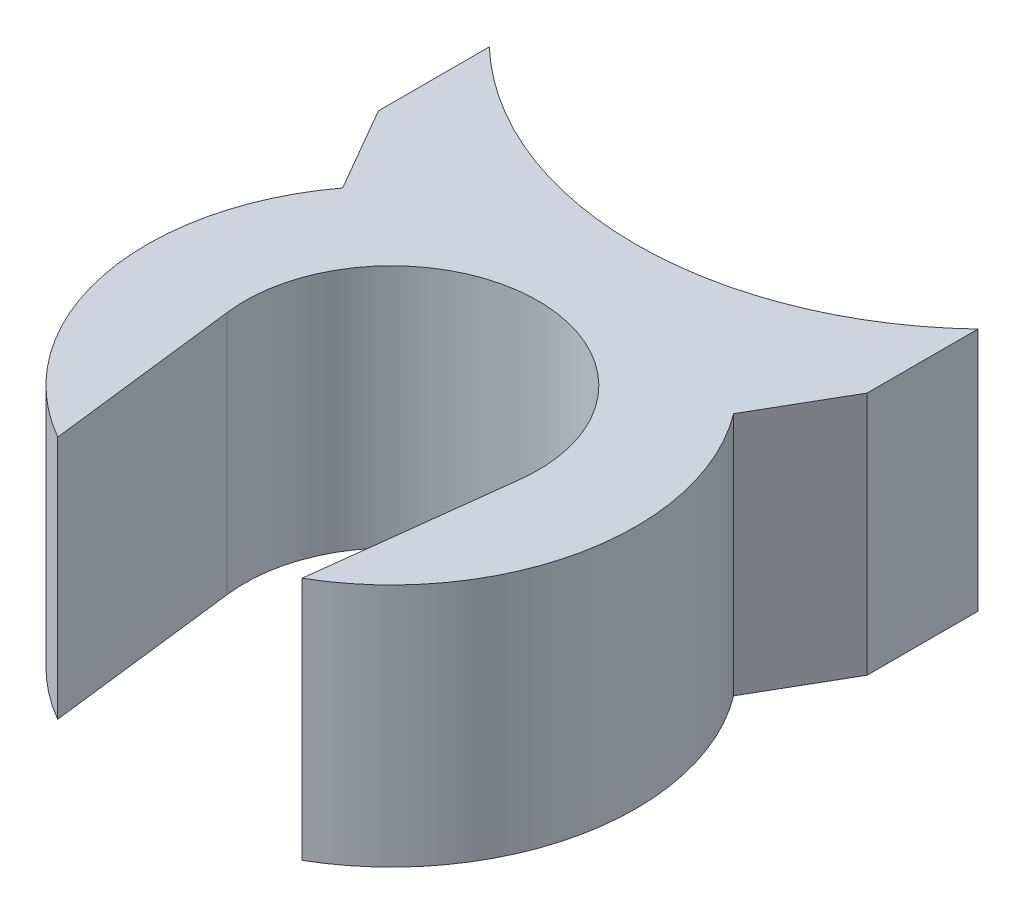
ISO-10303-21;
HEADER;
FILE_DESCRIPTION(('STEP AP214'),'2;1');
FILE_NAME('part.step','',(''),(''),'','','');
FILE_SCHEMA(('AUTOMOTIVE_DESIGN { 1 0 10303 214 1 1 1 1 }'));
ENDSEC;
DATA;
#1=APPLICATION_CONTEXT('core data for automotive mechanical design processes');
#2=APPLICATION_PROTOCOL_DEFINITION('international standard','automotive_design',2000,#1);
#3=PRODUCT_CONTEXT('',#1,'mechanical');
#4=PRODUCT('Part','Part','',(#3));
#5=PRODUCT_RELATED_PRODUCT_CATEGORY('part','',(#4));
#6=PRODUCT_DEFINITION_FORMATION('','',#4);
#7=PRODUCT_DEFINITION_CONTEXT('part definition',#1,'design');
#8=PRODUCT_DEFINITION('design','',#6,#7);
#9=PRODUCT_DEFINITION_SHAPE('','',#8);
#10=(LENGTH_UNIT() NAMED_UNIT(*) SI_UNIT(.MILLI.,.METRE.));
#11=(NAMED_UNIT(*) PLANE_ANGLE_UNIT() SI_UNIT($,.RADIAN.));
#12=(NAMED_UNIT(*) SI_UNIT($,.STERADIAN.) SOLID_ANGLE_UNIT());
#13=UNCERTAINTY_MEASURE_WITH_UNIT(LENGTH_MEASURE(1.E-05),#10,'distance_accuracy_value','');
#14=(GEOMETRIC_REPRESENTATION_CONTEXT(3) GLOBAL_UNCERTAINTY_ASSIGNED_CONTEXT((#13)) GLOBAL_UNIT_ASSIGNED_CONTEXT((#10,
#11,#12)) REPRESENTATION_CONTEXT('',''));
#15=CARTESIAN_POINT('',(0.,0.,0.));
#16=DIRECTION('',(0.,0.,1.));
#17=DIRECTION('',(1.,0.,0.));
#18=AXIS2_PLACEMENT_3D('',#15,#16,#17);
#19=CARTESIAN_POINT('',(0.,5.,0.));
#20=DIRECTION('',(0.,-1.,0.));
#21=DIRECTION('',(0.,0.,-1.));
#22=AXIS2_PLACEMENT_3D('',#19,#20,#21);
#23=CYLINDRICAL_SURFACE('',#22,5.);
#24=DIRECTION('',(0.,1.,0.));
#25=VECTOR('',#24,1.);
#26=CARTESIAN_POINT('',(-2.5,-5.,4.33012701892219));
#27=LINE('',#26,#25);
#28=CARTESIAN_POINT('',(-2.5,0.,4.33012701892219));
#29=VERTEX_POINT('',#28);
#30=CARTESIAN_POINT('',(-2.5,5.,4.33012701892219));
#31=VERTEX_POINT('',#30);
#32=EDGE_CURVE('E233',#29,#31,#27,.T.);
#33=ORIENTED_EDGE('',*,*,#32,.T.);
#34=CARTESIAN_POINT('',(0.,5.,0.));
#35=DIRECTION('',(0.,1.,0.));
#36=DIRECTION('',(0.,0.,1.));
#37=AXIS2_PLACEMENT_3D('',#34,#35,#36);
#38=CIRCLE('',#37,5.);
#39=CARTESIAN_POINT('',(-4.,5.,-3.));
#40=VERTEX_POINT('',#39);
#41=EDGE_CURVE('E137',#40,#31,#38,.T.);
#42=ORIENTED_EDGE('',*,*,#41,.F.);
#43=DIRECTION('',(0.,-1.,0.));
#44=VECTOR('',#43,1.);
#45=CARTESIAN_POINT('',(-4.,5.,-3.));
#46=LINE('',#45,#44);
#47=CARTESIAN_POINT('',(-4.,0.,-3.));
#48=VERTEX_POINT('',#47);
#49=EDGE_CURVE('E167',#40,#48,#46,.T.);
#50=ORIENTED_EDGE('',*,*,#49,.T.);
#51=CARTESIAN_POINT('',(0.,0.,0.));
#52=DIRECTION('',(0.,1.,0.));
#53=DIRECTION('',(0.,0.,1.));
#54=AXIS2_PLACEMENT_3D('',#51,#52,#53);
#55=CIRCLE('',#54,5.);
#56=EDGE_CURVE('E157',#48,#29,#55,.T.);
#57=ORIENTED_EDGE('',*,*,#56,.T.);
#58=EDGE_LOOP('',(#33,#42,#50,#57));
#59=FACE_BOUND('',#58,.T.);
#60=ADVANCED_FACE('F39',(#59),#23,.T.);
#61=CARTESIAN_POINT('',(0.,5.,-12.25));
#62=DIRECTION('',(0.,1.,0.));
#63=DIRECTION('',(0.,0.,1.));
#64=AXIS2_PLACEMENT_3D('',#61,#62,#63);
#65=PLANE('',#64);
#66=DIRECTION('',(-0.500000000000003,0.,0.866025403784437));
#67=VECTOR('',#66,1.);
#68=CARTESIAN_POINT('',(3.99999999999999,5.,-3.00000000000001));
#69=LINE('',#68,#67);
#70=CARTESIAN_POINT('',(5.,5.,-4.73205080756888));
#71=VERTEX_POINT('',#70);
#72=CARTESIAN_POINT('',(3.99999999999999,5.,-3.00000000000001));
#73=VERTEX_POINT('',#72);
#74=EDGE_CURVE('E115',#71,#73,#69,.T.);
#75=ORIENTED_EDGE('',*,*,#74,.F.);
#76=DIRECTION('',(0.,0.,-1.));
#77=VECTOR('',#76,1.);
#78=CARTESIAN_POINT('',(5.,5.,-7.));
#79=LINE('',#78,#77);
#80=CARTESIAN_POINT('',(5.,5.,-7.));
#81=VERTEX_POINT('',#80);
#82=EDGE_CURVE('E123',#71,#81,#79,.T.);
#83=ORIENTED_EDGE('',*,*,#82,.T.);
#84=CARTESIAN_POINT('',(0.,5.,-12.25));
#85=DIRECTION('',(0.,-1.,0.));
#86=DIRECTION('',(0.,0.,1.));
#87=AXIS2_PLACEMENT_3D('',#84,#85,#86);
#88=CIRCLE('',#87,7.25);
#89=CARTESIAN_POINT('',(-5.,5.,-7.));
#90=VERTEX_POINT('',#89);
#91=EDGE_CURVE('E163',#81,#90,#88,.T.);
#92=ORIENTED_EDGE('',*,*,#91,.T.);
#93=DIRECTION('',(0.,0.,1.));
#94=VECTOR('',#93,1.);
#95=CARTESIAN_POINT('',(-5.,5.,-7.));
#96=LINE('',#95,#94);
#97=CARTESIAN_POINT('',(-5.00000000000001,5.,-4.73205080756886));
#98=VERTEX_POINT('',#97);
#99=EDGE_CURVE('E204',#90,#98,#96,.T.);
#100=ORIENTED_EDGE('',*,*,#99,.T.);
#101=DIRECTION('',(-0.500000000000005,0.,-0.866025403784436));
#102=VECTOR('',#101,1.);
#103=CARTESIAN_POINT('',(-4.,5.,-3.));
#104=LINE('',#103,#102);
#105=EDGE_CURVE('E209',#40,#98,#104,.T.);
#106=ORIENTED_EDGE('',*,*,#105,.F.);
#107=ORIENTED_EDGE('',*,*,#41,.T.);
#108=DIRECTION('',(-0.119580915949593,0.,-0.992824458069329));
#109=VECTOR('',#108,1.);
#110=CARTESIAN_POINT('',(-2.97833606685758,5.,0.358726209840881));
#111=LINE('',#110,#109);
#112=CARTESIAN_POINT('',(-2.97489143229235,5.,0.387325400759562));
#113=VERTEX_POINT('',#112);
#114=EDGE_CURVE('E227',#31,#113,#111,.T.);
#115=ORIENTED_EDGE('',*,*,#114,.T.);
#116=CARTESIAN_POINT('',(0.,5.,0.));
#117=DIRECTION('',(0.,1.,0.));
#118=DIRECTION('',(0.,0.,1.));
#119=AXIS2_PLACEMENT_3D('',#116,#117,#118);
#120=CIRCLE('',#119,3.);
#121=CARTESIAN_POINT('',(2.97489143229235,5.,0.387325400759561));
#122=VERTEX_POINT('',#121);
#123=EDGE_CURVE('E152',#122,#113,#120,.T.);
#124=ORIENTED_EDGE('',*,*,#123,.F.);
#125=DIRECTION('',(0.119580915949592,0.,-0.992824458069329));
#126=VECTOR('',#125,1.);
#127=CARTESIAN_POINT('',(2.97833606685758,5.,0.35872620984088));
#128=LINE('',#127,#126);
#129=CARTESIAN_POINT('',(2.5,5.,4.33012701892219));
#130=VERTEX_POINT('',#129);
#131=EDGE_CURVE('E184',#130,#122,#128,.T.);
#132=ORIENTED_EDGE('',*,*,#131,.F.);
#133=EDGE_CURVE('E127',#130,#73,#38,.T.);
#134=ORIENTED_EDGE('',*,*,#133,.T.);
#135=EDGE_LOOP('',(#75,#83,#92,#100,#106,#107,#115,#124,#132,#134));
#136=FACE_BOUND('',#135,.T.);
#137=ADVANCED_FACE('F121',(#136),#65,.T.);
#138=CARTESIAN_POINT('',(0.,0.,-12.25));
#139=DIRECTION('',(0.,1.,0.));
#140=DIRECTION('',(0.,0.,1.));
#141=AXIS2_PLACEMENT_3D('',#138,#139,#140);
#142=PLANE('',#141);
#143=DIRECTION('',(0.,0.,-1.));
#144=VECTOR('',#143,1.);
#145=CARTESIAN_POINT('',(5.,0.,-7.));
#146=LINE('',#145,#144);
#147=CARTESIAN_POINT('',(5.,0.,-4.73205080756888));
#148=VERTEX_POINT('',#147);
#149=CARTESIAN_POINT('',(5.,0.,-7.));
#150=VERTEX_POINT('',#149);
#151=EDGE_CURVE('E161',#148,#150,#146,.T.);
#152=ORIENTED_EDGE('',*,*,#151,.F.);
#153=DIRECTION('',(-0.500000000000003,0.,0.866025403784437));
#154=VECTOR('',#153,1.);
#155=CARTESIAN_POINT('',(7.00536749250303,0.,-8.20544919243109));
#156=LINE('',#155,#154);
#157=CARTESIAN_POINT('',(3.99999999999999,0.,-3.00000000000001));
#158=VERTEX_POINT('',#157);
#159=EDGE_CURVE('E55',#148,#158,#156,.T.);
#160=ORIENTED_EDGE('',*,*,#159,.T.);
#161=CARTESIAN_POINT('',(2.5,0.,4.33012701892219));
#162=VERTEX_POINT('',#161);
#163=EDGE_CURVE('E156',#162,#158,#55,.T.);
#164=ORIENTED_EDGE('',*,*,#163,.F.);
#165=DIRECTION('',(0.119580915949592,0.,-0.992824458069329));
#166=VECTOR('',#165,1.);
#167=CARTESIAN_POINT('',(4.43269107825291,0.,-11.7161037457822));
#168=LINE('',#167,#166);
#169=CARTESIAN_POINT('',(2.97489143229235,0.,0.387325400759561));
#170=VERTEX_POINT('',#169);
#171=EDGE_CURVE('E182',#162,#170,#168,.T.);
#172=ORIENTED_EDGE('',*,*,#171,.T.);
#173=CARTESIAN_POINT('',(0.,0.,0.));
#174=DIRECTION('',(0.,1.,0.));
#175=DIRECTION('',(0.,0.,1.));
#176=AXIS2_PLACEMENT_3D('',#173,#174,#175);
#177=CIRCLE('',#176,3.);
#178=CARTESIAN_POINT('',(-2.97489143229235,0.,0.387325400759562));
#179=VERTEX_POINT('',#178);
#180=EDGE_CURVE('E193',#170,#179,#177,.T.);
#181=ORIENTED_EDGE('',*,*,#180,.T.);
#182=DIRECTION('',(-0.119580915949593,0.,-0.992824458069329));
#183=VECTOR('',#182,1.);
#184=CARTESIAN_POINT('',(-4.43269107825292,0.,-11.7161037457822));
#185=LINE('',#184,#183);
#186=EDGE_CURVE('E62',#29,#179,#185,.T.);
#187=ORIENTED_EDGE('',*,*,#186,.F.);
#188=ORIENTED_EDGE('',*,*,#56,.F.);
#189=DIRECTION('',(-0.500000000000005,0.,-0.866025403784436));
#190=VECTOR('',#189,1.);
#191=CARTESIAN_POINT('',(-7.00536749250304,0.,-8.20544919243106));
#192=LINE('',#191,#190);
#193=CARTESIAN_POINT('',(-5.00000000000001,0.,-4.73205080756886));
#194=VERTEX_POINT('',#193);
#195=EDGE_CURVE('E224',#48,#194,#192,.T.);
#196=ORIENTED_EDGE('',*,*,#195,.T.);
#197=DIRECTION('',(0.,0.,1.));
#198=VECTOR('',#197,1.);
#199=CARTESIAN_POINT('',(-5.,0.,-7.));
#200=LINE('',#199,#198);
#201=CARTESIAN_POINT('',(-5.,0.,-7.));
#202=VERTEX_POINT('',#201);
#203=EDGE_CURVE('E151',#202,#194,#200,.T.);
#204=ORIENTED_EDGE('',*,*,#203,.F.);
#205=CARTESIAN_POINT('',(0.,0.,-12.25));
#206=DIRECTION('',(0.,-1.,0.));
#207=DIRECTION('',(0.,0.,1.));
#208=AXIS2_PLACEMENT_3D('',#205,#206,#207);
#209=CIRCLE('',#208,7.25);
#210=EDGE_CURVE('E147',#150,#202,#209,.T.);
#211=ORIENTED_EDGE('',*,*,#210,.F.);
#212=EDGE_LOOP('',(#152,#160,#164,#172,#181,#187,#188,#196,#204,#211));
#213=FACE_BOUND('',#212,.T.);
#214=ADVANCED_FACE('F192',(#213),#142,.F.);
#215=CARTESIAN_POINT('',(0.,5.,-12.25));
#216=DIRECTION('',(0.,-1.,0.));
#217=DIRECTION('',(0.,0.,-1.));
#218=AXIS2_PLACEMENT_3D('',#215,#216,#217);
#219=CYLINDRICAL_SURFACE('',#218,7.25);
#220=ORIENTED_EDGE('',*,*,#210,.T.);
#221=DIRECTION('',(0.,-1.,0.));
#222=VECTOR('',#221,1.);
#223=CARTESIAN_POINT('',(-5.,5.,-7.));
#224=LINE('',#223,#222);
#225=EDGE_CURVE('E171',#90,#202,#224,.T.);
#226=ORIENTED_EDGE('',*,*,#225,.F.);
#227=ORIENTED_EDGE('',*,*,#91,.F.);
#228=DIRECTION('',(0.,-1.,0.));
#229=VECTOR('',#228,1.);
#230=CARTESIAN_POINT('',(5.,5.,-7.));
#231=LINE('',#230,#229);
#232=EDGE_CURVE('E134',#81,#150,#231,.T.);
#233=ORIENTED_EDGE('',*,*,#232,.T.);
#234=EDGE_LOOP('',(#220,#226,#227,#233));
#235=FACE_BOUND('',#234,.T.);
#236=ADVANCED_FACE('F41',(#235),#219,.F.);
#237=CARTESIAN_POINT('',(-5.,5.,-7.));
#238=DIRECTION('',(1.,0.,0.));
#239=DIRECTION('',(0.,0.,-1.));
#240=AXIS2_PLACEMENT_3D('',#237,#238,#239);
#241=PLANE('',#240);
#242=ORIENTED_EDGE('',*,*,#203,.T.);
#243=DIRECTION('',(0.,1.,0.));
#244=VECTOR('',#243,1.);
#245=CARTESIAN_POINT('',(-5.00000000000001,-5.,-4.73205080756886));
#246=LINE('',#245,#244);
#247=EDGE_CURVE('E130',#194,#98,#246,.T.);
#248=ORIENTED_EDGE('',*,*,#247,.T.);
#249=ORIENTED_EDGE('',*,*,#99,.F.);
#250=ORIENTED_EDGE('',*,*,#225,.T.);
#251=EDGE_LOOP('',(#242,#248,#249,#250));
#252=FACE_BOUND('',#251,.T.);
#253=ADVANCED_FACE('F214',(#252),#241,.F.);
#254=ORIENTED_EDGE('',*,*,#133,.F.);
#255=DIRECTION('',(0.,1.,0.));
#256=VECTOR('',#255,1.);
#257=CARTESIAN_POINT('',(2.5,-5.,4.33012701892219));
#258=LINE('',#257,#256);
#259=EDGE_CURVE('E234',#162,#130,#258,.T.);
#260=ORIENTED_EDGE('',*,*,#259,.F.);
#261=ORIENTED_EDGE('',*,*,#163,.T.);
#262=DIRECTION('',(0.,-1.,0.));
#263=VECTOR('',#262,1.);
#264=CARTESIAN_POINT('',(3.99999999999999,5.,-3.00000000000001));
#265=LINE('',#264,#263);
#266=EDGE_CURVE('E141',#73,#158,#265,.T.);
#267=ORIENTED_EDGE('',*,*,#266,.F.);
#268=EDGE_LOOP('',(#254,#260,#261,#267));
#269=FACE_BOUND('',#268,.T.);
#270=ADVANCED_FACE('F254',(#269),#23,.T.);
#271=CARTESIAN_POINT('',(5.,5.,-7.));
#272=DIRECTION('',(-1.,0.,0.));
#273=DIRECTION('',(0.,0.,1.));
#274=AXIS2_PLACEMENT_3D('',#271,#272,#273);
#275=PLANE('',#274);
#276=ORIENTED_EDGE('',*,*,#82,.F.);
#277=DIRECTION('',(0.,-1.,0.));
#278=VECTOR('',#277,1.);
#279=CARTESIAN_POINT('',(5.,5.,-4.73205080756888));
#280=LINE('',#279,#278);
#281=EDGE_CURVE('E11',#71,#148,#280,.T.);
#282=ORIENTED_EDGE('',*,*,#281,.T.);
#283=ORIENTED_EDGE('',*,*,#151,.T.);
#284=ORIENTED_EDGE('',*,*,#232,.F.);
#285=EDGE_LOOP('',(#276,#282,#283,#284));
#286=FACE_BOUND('',#285,.T.);
#287=ADVANCED_FACE('F132',(#286),#275,.F.);
#288=CARTESIAN_POINT('',(0.,5.,0.));
#289=DIRECTION('',(0.,-1.,0.));
#290=DIRECTION('',(0.,0.,-1.));
#291=AXIS2_PLACEMENT_3D('',#288,#289,#290);
#292=CYLINDRICAL_SURFACE('',#291,3.);
#293=DIRECTION('',(0.,-1.,0.));
#294=VECTOR('',#293,1.);
#295=CARTESIAN_POINT('',(2.97489143229236,5.,0.387325400759503));
#296=LINE('',#295,#294);
#297=EDGE_CURVE('E48',#122,#170,#296,.T.);
#298=ORIENTED_EDGE('',*,*,#297,.F.);
#299=ORIENTED_EDGE('',*,*,#123,.T.);
#300=DIRECTION('',(0.,-1.,0.));
#301=VECTOR('',#300,1.);
#302=CARTESIAN_POINT('',(-2.97489143229235,5.,0.387325400759562));
#303=LINE('',#302,#301);
#304=EDGE_CURVE('E175',#113,#179,#303,.T.);
#305=ORIENTED_EDGE('',*,*,#304,.T.);
#306=ORIENTED_EDGE('',*,*,#180,.F.);
#307=EDGE_LOOP('',(#298,#299,#305,#306));
#308=FACE_BOUND('',#307,.T.);
#309=ADVANCED_FACE('F197',(#308),#292,.F.);
#310=CARTESIAN_POINT('',(-2.97833606685758,-5.,0.358726209840881));
#311=DIRECTION('',(0.992824458069329,0.,-0.119580915949593));
#312=DIRECTION('',(-0.119580915949593,0.,-0.992824458069329));
#313=AXIS2_PLACEMENT_3D('',#310,#311,#312);
#314=PLANE('',#313);
#315=ORIENTED_EDGE('',*,*,#186,.T.);
#316=ORIENTED_EDGE('',*,*,#304,.F.);
#317=ORIENTED_EDGE('',*,*,#114,.F.);
#318=ORIENTED_EDGE('',*,*,#32,.F.);
#319=EDGE_LOOP('',(#315,#316,#317,#318));
#320=FACE_BOUND('',#319,.T.);
#321=ADVANCED_FACE('F243',(#320),#314,.T.);
#322=CARTESIAN_POINT('',(2.97833606685758,-5.,0.35872620984088));
#323=DIRECTION('',(0.992824458069329,0.,0.119580915949592));
#324=DIRECTION('',(0.119580915949592,0.,-0.992824458069329));
#325=AXIS2_PLACEMENT_3D('',#322,#323,#324);
#326=PLANE('',#325);
#327=ORIENTED_EDGE('',*,*,#259,.T.);
#328=ORIENTED_EDGE('',*,*,#131,.T.);
#329=ORIENTED_EDGE('',*,*,#297,.T.);
#330=ORIENTED_EDGE('',*,*,#171,.F.);
#331=EDGE_LOOP('',(#327,#328,#329,#330));
#332=FACE_BOUND('',#331,.T.);
#333=ADVANCED_FACE('F181',(#332),#326,.F.);
#334=CARTESIAN_POINT('',(3.99999999999999,-5.,-3.00000000000001));
#335=DIRECTION('',(-0.866025403784437,0.,-0.500000000000003));
#336=DIRECTION('',(-0.500000000000003,0.,0.866025403784437));
#337=AXIS2_PLACEMENT_3D('',#334,#335,#336);
#338=PLANE('',#337);
#339=ORIENTED_EDGE('',*,*,#281,.F.);
#340=ORIENTED_EDGE('',*,*,#74,.T.);
#341=ORIENTED_EDGE('',*,*,#266,.T.);
#342=ORIENTED_EDGE('',*,*,#159,.F.);
#343=EDGE_LOOP('',(#339,#340,#341,#342));
#344=FACE_BOUND('',#343,.T.);
#345=ADVANCED_FACE('F114',(#344),#338,.F.);
#346=CARTESIAN_POINT('',(-4.,-5.,-3.));
#347=DIRECTION('',(0.866025403784436,0.,-0.500000000000005));
#348=DIRECTION('',(-0.500000000000005,0.,-0.866025403784436));
#349=AXIS2_PLACEMENT_3D('',#346,#347,#348);
#350=PLANE('',#349);
#351=ORIENTED_EDGE('',*,*,#49,.F.);
#352=ORIENTED_EDGE('',*,*,#105,.T.);
#353=ORIENTED_EDGE('',*,*,#247,.F.);
#354=ORIENTED_EDGE('',*,*,#195,.F.);
#355=EDGE_LOOP('',(#351,#352,#353,#354));
#356=FACE_BOUND('',#355,.T.);
#357=ADVANCED_FACE('F329',(#356),#350,.F.);
#358=CLOSED_SHELL('',(#60,#137,#214,#236,#253,#270,#287,#309,#321,#333,#345,#357));
#359=MANIFOLD_SOLID_BREP('B2',#358);
#360=ADVANCED_BREP_SHAPE_REPRESENTATION('',(#18,#359),#14);
#361=SHAPE_DEFINITION_REPRESENTATION(#9,#360);
ENDSEC;
END-ISO-10303-21;
